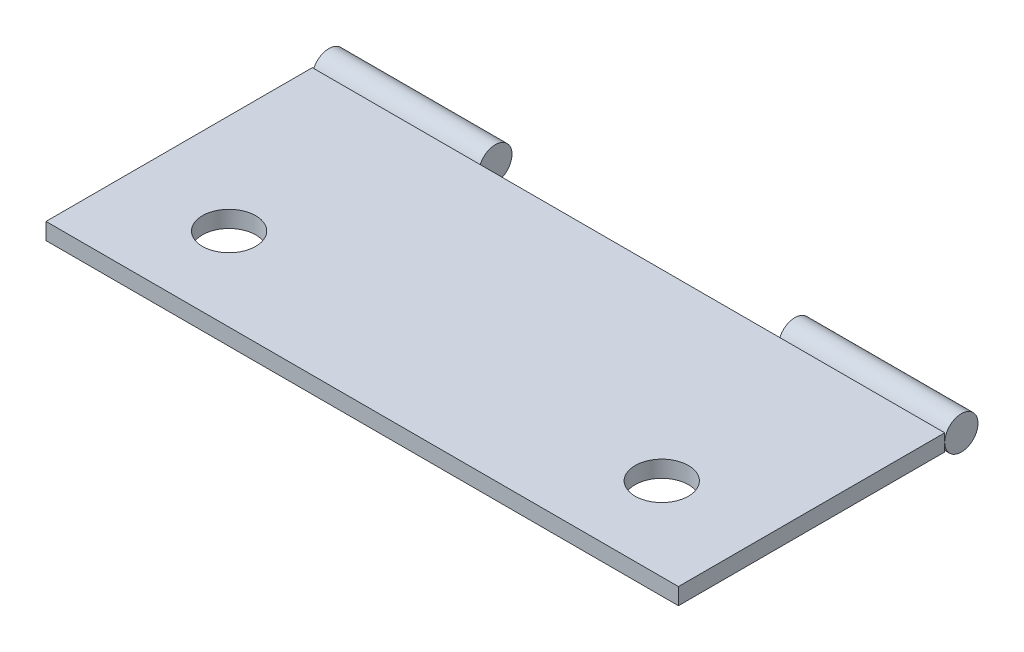
ISO-10303-21;
HEADER;
FILE_DESCRIPTION(('STEP AP214'),'2;1');
FILE_NAME('part.step','',(''),(''),'','','');
FILE_SCHEMA(('AUTOMOTIVE_DESIGN { 1 0 10303 214 1 1 1 1 }'));
ENDSEC;
DATA;
#1=APPLICATION_CONTEXT('core data for automotive mechanical design processes');
#2=APPLICATION_PROTOCOL_DEFINITION('international standard','automotive_design',2000,#1);
#3=PRODUCT_CONTEXT('',#1,'mechanical');
#4=PRODUCT('Part','Part','',(#3));
#5=PRODUCT_RELATED_PRODUCT_CATEGORY('part','',(#4));
#6=PRODUCT_DEFINITION_FORMATION('','',#4);
#7=PRODUCT_DEFINITION_CONTEXT('part definition',#1,'design');
#8=PRODUCT_DEFINITION('design','',#6,#7);
#9=PRODUCT_DEFINITION_SHAPE('','',#8);
#10=(LENGTH_UNIT() NAMED_UNIT(*) SI_UNIT(.MILLI.,.METRE.));
#11=(NAMED_UNIT(*) PLANE_ANGLE_UNIT() SI_UNIT($,.RADIAN.));
#12=(NAMED_UNIT(*) SI_UNIT($,.STERADIAN.) SOLID_ANGLE_UNIT());
#13=UNCERTAINTY_MEASURE_WITH_UNIT(LENGTH_MEASURE(1.E-05),#10,'distance_accuracy_value','');
#14=(GEOMETRIC_REPRESENTATION_CONTEXT(3) GLOBAL_UNCERTAINTY_ASSIGNED_CONTEXT((#13)) GLOBAL_UNIT_ASSIGNED_CONTEXT((#10,
#11,#12)) REPRESENTATION_CONTEXT('',''));
#15=CARTESIAN_POINT('',(0.,0.,0.));
#16=DIRECTION('',(0.,0.,1.));
#17=DIRECTION('',(1.,0.,0.));
#18=AXIS2_PLACEMENT_3D('',#15,#16,#17);
#19=CARTESIAN_POINT('',(-21.8284271247462,0.496867391560925,-2.5));
#20=DIRECTION('',(1.,0.,0.));
#21=DIRECTION('',(0.,0.,-1.));
#22=AXIS2_PLACEMENT_3D('',#19,#20,#21);
#23=CYLINDRICAL_SURFACE('',#22,1.);
#24=CARTESIAN_POINT('',(9.,0.496867391560925,-2.5));
#25=DIRECTION('',(1.,0.,0.));
#26=DIRECTION('',(0.,0.,-1.));
#27=AXIS2_PLACEMENT_3D('',#24,#25,#26);
#28=CIRCLE('',#27,1.);
#29=CARTESIAN_POINT('',(9.,0.496867391560925,-3.5));
#30=VERTEX_POINT('',#29);
#31=EDGE_CURVE('E11',#30,#30,#28,.F.);
#32=ORIENTED_EDGE('',*,*,#31,.F.);
#33=EDGE_LOOP('',(#32));
#34=FACE_BOUND('',#33,.T.);
#35=CARTESIAN_POINT('',(19.,0.496867391560925,-2.5));
#36=DIRECTION('',(1.,0.,0.));
#37=DIRECTION('',(0.,0.,-1.));
#38=AXIS2_PLACEMENT_3D('',#35,#36,#37);
#39=CIRCLE('',#38,1.);
#40=CARTESIAN_POINT('',(19.,0.496867391560925,-3.5));
#41=VERTEX_POINT('',#40);
#42=EDGE_CURVE('E55',#41,#41,#39,.T.);
#43=ORIENTED_EDGE('',*,*,#42,.F.);
#44=EDGE_LOOP('',(#43));
#45=FACE_BOUND('',#44,.T.);
#46=ADVANCED_FACE('F52',(#34,#45),#23,.T.);
#47=CARTESIAN_POINT('',(19.,0.496867391560925,-2.5));
#48=DIRECTION('',(1.,0.,0.));
#49=DIRECTION('',(0.,0.,-1.));
#50=AXIS2_PLACEMENT_3D('',#47,#48,#49);
#51=PLANE('',#50);
#52=ORIENTED_EDGE('',*,*,#42,.T.);
#53=EDGE_LOOP('',(#52));
#54=FACE_BOUND('',#53,.T.);
#55=ADVANCED_FACE('F64',(#54),#51,.T.);
#56=CARTESIAN_POINT('',(9.,-0.503132608439075,-1.5));
#57=DIRECTION('',(1.,0.,0.));
#58=DIRECTION('',(0.,0.,-1.));
#59=AXIS2_PLACEMENT_3D('',#56,#57,#58);
#60=PLANE('',#59);
#61=ORIENTED_EDGE('',*,*,#31,.T.);
#62=EDGE_LOOP('',(#61));
#63=FACE_BOUND('',#62,.T.);
#64=ADVANCED_FACE('F71',(#63),#60,.F.);
#65=CLOSED_SHELL('',(#46,#55,#64));
#66=MANIFOLD_SOLID_BREP('B2',#65);
#67=CARTESIAN_POINT('',(-19.,1.,-14.5));
#68=DIRECTION('',(1.,0.,0.));
#69=DIRECTION('',(0.,0.,-1.));
#70=AXIS2_PLACEMENT_3D('',#67,#68,#69);
#71=PLANE('',#70);
#72=CARTESIAN_POINT('',(-19.,0.496867391560925,-2.5));
#73=DIRECTION('',(1.,0.,0.));
#74=DIRECTION('',(0.,0.,-1.));
#75=AXIS2_PLACEMENT_3D('',#72,#73,#74);
#76=CIRCLE('',#75,1.);
#77=CARTESIAN_POINT('',(-19.,0.496867391560925,-3.5));
#78=VERTEX_POINT('',#77);
#79=EDGE_CURVE('E109',#78,#78,#76,.F.);
#80=ORIENTED_EDGE('',*,*,#79,.T.);
#81=EDGE_LOOP('',(#80));
#82=FACE_BOUND('',#81,.T.);
#83=ADVANCED_FACE('F102',(#82),#71,.F.);
#84=CARTESIAN_POINT('',(-21.8284271247462,0.496867391560925,-2.5));
#85=DIRECTION('',(1.,0.,0.));
#86=DIRECTION('',(0.,0.,-1.));
#87=AXIS2_PLACEMENT_3D('',#84,#85,#86);
#88=CYLINDRICAL_SURFACE('',#87,1.);
#89=CARTESIAN_POINT('',(-9.,0.496867391560925,-2.5));
#90=DIRECTION('',(-1.,0.,0.));
#91=DIRECTION('',(0.,0.,1.));
#92=AXIS2_PLACEMENT_3D('',#89,#90,#91);
#93=CIRCLE('',#92,1.);
#94=CARTESIAN_POINT('',(-9.,0.496867391560925,-1.5));
#95=VERTEX_POINT('',#94);
#96=EDGE_CURVE('E51',#95,#95,#93,.F.);
#97=ORIENTED_EDGE('',*,*,#96,.F.);
#98=EDGE_LOOP('',(#97));
#99=FACE_BOUND('',#98,.T.);
#100=ORIENTED_EDGE('',*,*,#79,.F.);
#101=EDGE_LOOP('',(#100));
#102=FACE_BOUND('',#101,.T.);
#103=ADVANCED_FACE('F104',(#99,#102),#88,.T.);
#104=CARTESIAN_POINT('',(-9.,-0.503132608439075,-1.5));
#105=DIRECTION('',(-1.,0.,0.));
#106=DIRECTION('',(0.,0.,1.));
#107=AXIS2_PLACEMENT_3D('',#104,#105,#106);
#108=PLANE('',#107);
#109=ORIENTED_EDGE('',*,*,#96,.T.);
#110=EDGE_LOOP('',(#109));
#111=FACE_BOUND('',#110,.T.);
#112=ADVANCED_FACE('F117',(#111),#108,.F.);
#113=CLOSED_SHELL('',(#83,#103,#112));
#114=MANIFOLD_SOLID_BREP('B6',#113);
#115=CARTESIAN_POINT('',(19.,1.,-14.5));
#116=DIRECTION('',(-1.,0.,0.));
#117=DIRECTION('',(0.,0.,1.));
#118=AXIS2_PLACEMENT_3D('',#115,#116,#117);
#119=PLANE('',#118);
#120=DIRECTION('',(0.,0.,-1.));
#121=VECTOR('',#120,1.);
#122=CARTESIAN_POINT('',(19.,0.,-14.5));
#123=LINE('',#122,#121);
#124=CARTESIAN_POINT('',(19.,0.,14.5));
#125=VERTEX_POINT('',#124);
#126=CARTESIAN_POINT('',(19.,0.,-1.5));
#127=VERTEX_POINT('',#126);
#128=EDGE_CURVE('E194',#125,#127,#123,.T.);
#129=ORIENTED_EDGE('',*,*,#128,.T.);
#130=DIRECTION('',(0.,1.,0.));
#131=VECTOR('',#130,1.);
#132=CARTESIAN_POINT('',(19.,-7.,-1.5));
#133=LINE('',#132,#131);
#134=CARTESIAN_POINT('',(19.,1.,-1.5));
#135=VERTEX_POINT('',#134);
#136=EDGE_CURVE('E158',#127,#135,#133,.T.);
#137=ORIENTED_EDGE('',*,*,#136,.T.);
#138=DIRECTION('',(0.,0.,-1.));
#139=VECTOR('',#138,1.);
#140=CARTESIAN_POINT('',(19.,1.,-14.5));
#141=LINE('',#140,#139);
#142=CARTESIAN_POINT('',(19.,1.,14.5));
#143=VERTEX_POINT('',#142);
#144=EDGE_CURVE('E189',#143,#135,#141,.T.);
#145=ORIENTED_EDGE('',*,*,#144,.F.);
#146=DIRECTION('',(0.,-1.,0.));
#147=VECTOR('',#146,1.);
#148=CARTESIAN_POINT('',(19.,1.,14.5));
#149=LINE('',#148,#147);
#150=EDGE_CURVE('E182',#143,#125,#149,.T.);
#151=ORIENTED_EDGE('',*,*,#150,.T.);
#152=EDGE_LOOP('',(#129,#137,#145,#151));
#153=FACE_BOUND('',#152,.T.);
#154=ADVANCED_FACE('F143',(#153),#119,.F.);
#155=CARTESIAN_POINT('',(-19.,1.,-14.5));
#156=DIRECTION('',(1.,0.,0.));
#157=DIRECTION('',(0.,0.,-1.));
#158=AXIS2_PLACEMENT_3D('',#155,#156,#157);
#159=PLANE('',#158);
#160=DIRECTION('',(0.,0.,1.));
#161=VECTOR('',#160,1.);
#162=CARTESIAN_POINT('',(-19.,1.,-14.5));
#163=LINE('',#162,#161);
#164=CARTESIAN_POINT('',(-19.,1.,-1.5));
#165=VERTEX_POINT('',#164);
#166=CARTESIAN_POINT('',(-19.,1.,14.5));
#167=VERTEX_POINT('',#166);
#168=EDGE_CURVE('E212',#165,#167,#163,.T.);
#169=ORIENTED_EDGE('',*,*,#168,.F.);
#170=DIRECTION('',(0.,1.,0.));
#171=VECTOR('',#170,1.);
#172=CARTESIAN_POINT('',(-19.,-7.,-1.5));
#173=LINE('',#172,#171);
#174=CARTESIAN_POINT('',(-19.,0.,-1.5));
#175=VERTEX_POINT('',#174);
#176=EDGE_CURVE('E229',#175,#165,#173,.T.);
#177=ORIENTED_EDGE('',*,*,#176,.F.);
#178=DIRECTION('',(0.,0.,1.));
#179=VECTOR('',#178,1.);
#180=CARTESIAN_POINT('',(-19.,0.,-14.5));
#181=LINE('',#180,#179);
#182=CARTESIAN_POINT('',(-19.,0.,14.5));
#183=VERTEX_POINT('',#182);
#184=EDGE_CURVE('E190',#175,#183,#181,.T.);
#185=ORIENTED_EDGE('',*,*,#184,.T.);
#186=DIRECTION('',(0.,-1.,0.));
#187=VECTOR('',#186,1.);
#188=CARTESIAN_POINT('',(-19.,1.,14.5));
#189=LINE('',#188,#187);
#190=EDGE_CURVE('E151',#167,#183,#189,.T.);
#191=ORIENTED_EDGE('',*,*,#190,.F.);
#192=EDGE_LOOP('',(#169,#177,#185,#191));
#193=FACE_BOUND('',#192,.T.);
#194=ADVANCED_FACE('F246',(#193),#159,.F.);
#195=CARTESIAN_POINT('',(-19.,1.,14.5));
#196=DIRECTION('',(0.,0.,-1.));
#197=DIRECTION('',(-1.,0.,0.));
#198=AXIS2_PLACEMENT_3D('',#195,#196,#197);
#199=PLANE('',#198);
#200=DIRECTION('',(1.,0.,0.));
#201=VECTOR('',#200,1.);
#202=CARTESIAN_POINT('',(-19.,0.,14.5));
#203=LINE('',#202,#201);
#204=EDGE_CURVE('E179',#183,#125,#203,.T.);
#205=ORIENTED_EDGE('',*,*,#204,.T.);
#206=ORIENTED_EDGE('',*,*,#150,.F.);
#207=DIRECTION('',(1.,0.,0.));
#208=VECTOR('',#207,1.);
#209=CARTESIAN_POINT('',(-19.,1.,14.5));
#210=LINE('',#209,#208);
#211=EDGE_CURVE('E166',#167,#143,#210,.T.);
#212=ORIENTED_EDGE('',*,*,#211,.F.);
#213=ORIENTED_EDGE('',*,*,#190,.T.);
#214=EDGE_LOOP('',(#205,#206,#212,#213));
#215=FACE_BOUND('',#214,.T.);
#216=ADVANCED_FACE('F181',(#215),#199,.F.);
#217=CARTESIAN_POINT('',(0.,1.,0.));
#218=DIRECTION('',(0.,1.,0.));
#219=DIRECTION('',(0.,0.,1.));
#220=AXIS2_PLACEMENT_3D('',#217,#218,#219);
#221=PLANE('',#220);
#222=DIRECTION('',(1.,0.,0.));
#223=VECTOR('',#222,1.);
#224=CARTESIAN_POINT('',(-19.,1.,-1.5));
#225=LINE('',#224,#223);
#226=EDGE_CURVE('E233',#165,#135,#225,.T.);
#227=ORIENTED_EDGE('',*,*,#226,.F.);
#228=ORIENTED_EDGE('',*,*,#168,.T.);
#229=ORIENTED_EDGE('',*,*,#211,.T.);
#230=ORIENTED_EDGE('',*,*,#144,.T.);
#231=EDGE_LOOP('',(#227,#228,#229,#230));
#232=FACE_BOUND('',#231,.T.);
#233=CARTESIAN_POINT('',(-13.,1.,9.50000000000001));
#234=DIRECTION('',(0.,1.,0.));
#235=DIRECTION('',(0.,0.,-1.));
#236=AXIS2_PLACEMENT_3D('',#233,#234,#235);
#237=CIRCLE('',#236,1.6);
#238=CARTESIAN_POINT('',(-13.,1.,7.9));
#239=VERTEX_POINT('',#238);
#240=EDGE_CURVE('E221',#239,#239,#237,.T.);
#241=ORIENTED_EDGE('',*,*,#240,.F.);
#242=EDGE_LOOP('',(#241));
#243=FACE_BOUND('',#242,.T.);
#244=CARTESIAN_POINT('',(13.,1.,9.50000000000001));
#245=DIRECTION('',(0.,1.,0.));
#246=DIRECTION('',(0.,0.,1.));
#247=AXIS2_PLACEMENT_3D('',#244,#245,#246);
#248=CIRCLE('',#247,1.6);
#249=CARTESIAN_POINT('',(13.,1.,11.1));
#250=VERTEX_POINT('',#249);
#251=EDGE_CURVE('E205',#250,#250,#248,.T.);
#252=ORIENTED_EDGE('',*,*,#251,.F.);
#253=EDGE_LOOP('',(#252));
#254=FACE_BOUND('',#253,.T.);
#255=ADVANCED_FACE('F242',(#232,#243,#254),#221,.T.);
#256=CARTESIAN_POINT('',(0.,0.,0.));
#257=DIRECTION('',(0.,1.,0.));
#258=DIRECTION('',(0.,0.,1.));
#259=AXIS2_PLACEMENT_3D('',#256,#257,#258);
#260=PLANE('',#259);
#261=CARTESIAN_POINT('',(-13.,0.,9.50000000000001));
#262=DIRECTION('',(0.,1.,0.));
#263=DIRECTION('',(0.,0.,1.));
#264=AXIS2_PLACEMENT_3D('',#261,#262,#263);
#265=CIRCLE('',#264,1.6);
#266=CARTESIAN_POINT('',(-13.,0.,11.1));
#267=VERTEX_POINT('',#266);
#268=EDGE_CURVE('E225',#267,#267,#265,.F.);
#269=ORIENTED_EDGE('',*,*,#268,.F.);
#270=EDGE_LOOP('',(#269));
#271=FACE_BOUND('',#270,.T.);
#272=CARTESIAN_POINT('',(13.,0.,9.50000000000001));
#273=DIRECTION('',(0.,1.,0.));
#274=DIRECTION('',(0.,0.,1.));
#275=AXIS2_PLACEMENT_3D('',#272,#273,#274);
#276=CIRCLE('',#275,1.6);
#277=CARTESIAN_POINT('',(13.,0.,11.1));
#278=VERTEX_POINT('',#277);
#279=EDGE_CURVE('E199',#278,#278,#276,.F.);
#280=ORIENTED_EDGE('',*,*,#279,.F.);
#281=EDGE_LOOP('',(#280));
#282=FACE_BOUND('',#281,.T.);
#283=ORIENTED_EDGE('',*,*,#184,.F.);
#284=DIRECTION('',(1.,0.,0.));
#285=VECTOR('',#284,1.);
#286=CARTESIAN_POINT('',(0.,0.,-1.5));
#287=LINE('',#286,#285);
#288=EDGE_CURVE('E100',#175,#127,#287,.T.);
#289=ORIENTED_EDGE('',*,*,#288,.T.);
#290=ORIENTED_EDGE('',*,*,#128,.F.);
#291=ORIENTED_EDGE('',*,*,#204,.F.);
#292=EDGE_LOOP('',(#283,#289,#290,#291));
#293=FACE_BOUND('',#292,.T.);
#294=ADVANCED_FACE('F197',(#271,#282,#293),#260,.F.);
#295=CARTESIAN_POINT('',(13.,-0.000999999999999916,9.50000000000001));
#296=DIRECTION('',(0.,1.,0.));
#297=DIRECTION('',(0.,0.,1.));
#298=AXIS2_PLACEMENT_3D('',#295,#296,#297);
#299=CYLINDRICAL_SURFACE('',#298,1.6);
#300=ORIENTED_EDGE('',*,*,#251,.T.);
#301=EDGE_LOOP('',(#300));
#302=FACE_BOUND('',#301,.T.);
#303=ORIENTED_EDGE('',*,*,#279,.T.);
#304=EDGE_LOOP('',(#303));
#305=FACE_BOUND('',#304,.T.);
#306=ADVANCED_FACE('F258',(#302,#305),#299,.F.);
#307=CARTESIAN_POINT('',(-13.,-0.000999999999999916,9.50000000000001));
#308=DIRECTION('',(0.,1.,0.));
#309=DIRECTION('',(0.,0.,1.));
#310=AXIS2_PLACEMENT_3D('',#307,#308,#309);
#311=CYLINDRICAL_SURFACE('',#310,1.6);
#312=ORIENTED_EDGE('',*,*,#240,.T.);
#313=EDGE_LOOP('',(#312));
#314=FACE_BOUND('',#313,.T.);
#315=ORIENTED_EDGE('',*,*,#268,.T.);
#316=EDGE_LOOP('',(#315));
#317=FACE_BOUND('',#316,.T.);
#318=ADVANCED_FACE('F264',(#314,#317),#311,.F.);
#319=CARTESIAN_POINT('',(-19.,-7.,-1.5));
#320=DIRECTION('',(0.,0.,1.));
#321=DIRECTION('',(1.,0.,0.));
#322=AXIS2_PLACEMENT_3D('',#319,#320,#321);
#323=PLANE('',#322);
#324=ORIENTED_EDGE('',*,*,#176,.T.);
#325=ORIENTED_EDGE('',*,*,#226,.T.);
#326=ORIENTED_EDGE('',*,*,#136,.F.);
#327=ORIENTED_EDGE('',*,*,#288,.F.);
#328=EDGE_LOOP('',(#324,#325,#326,#327));
#329=FACE_BOUND('',#328,.T.);
#330=ADVANCED_FACE('F237',(#329),#323,.F.);
#331=CLOSED_SHELL('',(#154,#194,#216,#255,#294,#306,#318,#330));
#332=MANIFOLD_SOLID_BREP('B46',#331);
#333=ADVANCED_BREP_SHAPE_REPRESENTATION('',(#18,#66,#114,#332),#14);
#334=SHAPE_DEFINITION_REPRESENTATION(#9,#333);
ENDSEC;
END-ISO-10303-21;
